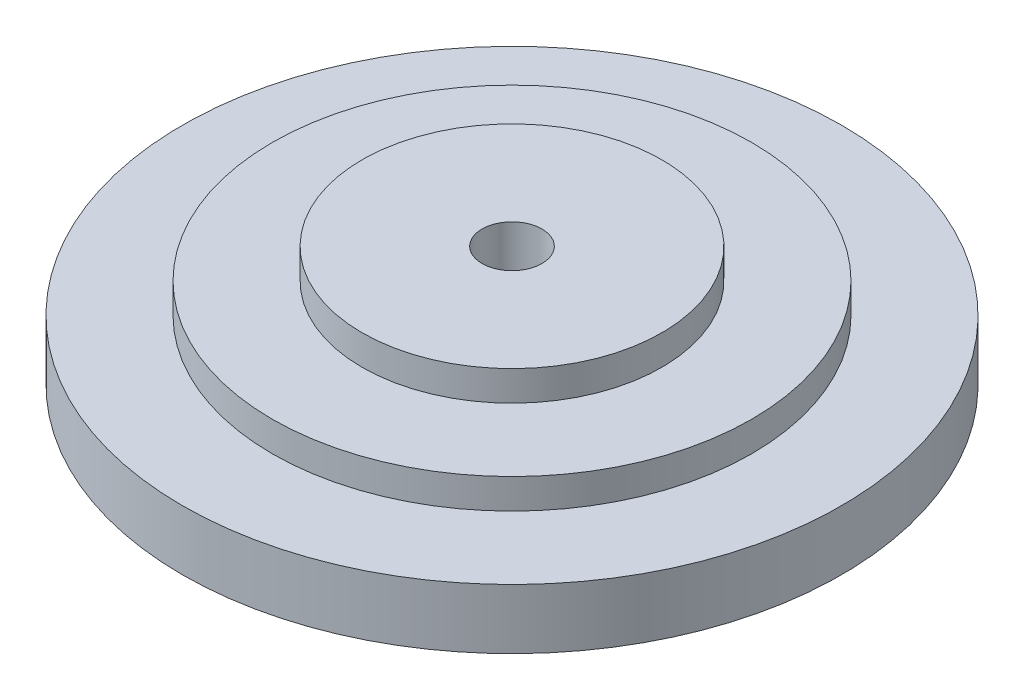
ISO-10303-21;
HEADER;
FILE_DESCRIPTION(('STEP AP214'),'2;1');
FILE_NAME('part.step','',(''),(''),'','','');
FILE_SCHEMA(('AUTOMOTIVE_DESIGN { 1 0 10303 214 1 1 1 1 }'));
ENDSEC;
DATA;
#1=APPLICATION_CONTEXT('core data for automotive mechanical design processes');
#2=APPLICATION_PROTOCOL_DEFINITION('international standard','automotive_design',2000,#1);
#3=PRODUCT_CONTEXT('',#1,'mechanical');
#4=PRODUCT('Part','Part','',(#3));
#5=PRODUCT_RELATED_PRODUCT_CATEGORY('part','',(#4));
#6=PRODUCT_DEFINITION_FORMATION('','',#4);
#7=PRODUCT_DEFINITION_CONTEXT('part definition',#1,'design');
#8=PRODUCT_DEFINITION('design','',#6,#7);
#9=PRODUCT_DEFINITION_SHAPE('','',#8);
#10=(LENGTH_UNIT() NAMED_UNIT(*) SI_UNIT(.MILLI.,.METRE.));
#11=(NAMED_UNIT(*) PLANE_ANGLE_UNIT() SI_UNIT($,.RADIAN.));
#12=(NAMED_UNIT(*) SI_UNIT($,.STERADIAN.) SOLID_ANGLE_UNIT());
#13=UNCERTAINTY_MEASURE_WITH_UNIT(LENGTH_MEASURE(1.E-05),#10,'distance_accuracy_value','');
#14=(GEOMETRIC_REPRESENTATION_CONTEXT(3) GLOBAL_UNCERTAINTY_ASSIGNED_CONTEXT((#13)) GLOBAL_UNIT_ASSIGNED_CONTEXT((#10,
#11,#12)) REPRESENTATION_CONTEXT('',''));
#15=CARTESIAN_POINT('',(0.,0.,0.));
#16=DIRECTION('',(0.,0.,1.));
#17=DIRECTION('',(1.,0.,0.));
#18=AXIS2_PLACEMENT_3D('',#15,#16,#17);
#19=CARTESIAN_POINT('',(0.,10.,0.));
#20=DIRECTION('',(0.,-1.,0.));
#21=DIRECTION('',(0.,0.,-1.));
#22=AXIS2_PLACEMENT_3D('',#19,#20,#21);
#23=CYLINDRICAL_SURFACE('',#22,55.0225);
#24=CARTESIAN_POINT('',(0.,10.,0.));
#25=DIRECTION('',(0.,1.,0.));
#26=DIRECTION('',(0.,0.,1.));
#27=AXIS2_PLACEMENT_3D('',#24,#25,#26);
#28=CIRCLE('',#27,55.0225);
#29=CARTESIAN_POINT('',(0.,10.,55.0225));
#30=VERTEX_POINT('',#29);
#31=EDGE_CURVE('E10',#30,#30,#28,.T.);
#32=ORIENTED_EDGE('',*,*,#31,.F.);
#33=EDGE_LOOP('',(#32));
#34=FACE_BOUND('',#33,.T.);
#35=CARTESIAN_POINT('',(0.,0.,0.));
#36=DIRECTION('',(0.,1.,0.));
#37=DIRECTION('',(0.,0.,1.));
#38=AXIS2_PLACEMENT_3D('',#35,#36,#37);
#39=CIRCLE('',#38,55.0225);
#40=CARTESIAN_POINT('',(0.,0.,55.0225));
#41=VERTEX_POINT('',#40);
#42=EDGE_CURVE('E38',#41,#41,#39,.T.);
#43=ORIENTED_EDGE('',*,*,#42,.T.);
#44=EDGE_LOOP('',(#43));
#45=FACE_BOUND('',#44,.T.);
#46=ADVANCED_FACE('F35',(#34,#45),#23,.T.);
#47=CARTESIAN_POINT('',(0.,10.,0.));
#48=DIRECTION('',(0.,1.,0.));
#49=DIRECTION('',(0.,0.,1.));
#50=AXIS2_PLACEMENT_3D('',#47,#48,#49);
#51=PLANE('',#50);
#52=CARTESIAN_POINT('',(0.,10.,0.));
#53=DIRECTION('',(0.,1.,0.));
#54=DIRECTION('',(0.,0.,1.));
#55=AXIS2_PLACEMENT_3D('',#52,#53,#54);
#56=CIRCLE('',#55,40.0225);
#57=CARTESIAN_POINT('',(0.,10.,40.0225));
#58=VERTEX_POINT('',#57);
#59=EDGE_CURVE('E42',#58,#58,#56,.T.);
#60=ORIENTED_EDGE('',*,*,#59,.F.);
#61=EDGE_LOOP('',(#60));
#62=FACE_BOUND('',#61,.T.);
#63=ORIENTED_EDGE('',*,*,#31,.T.);
#64=EDGE_LOOP('',(#63));
#65=FACE_BOUND('',#64,.T.);
#66=ADVANCED_FACE('F83',(#62,#65),#51,.T.);
#67=CARTESIAN_POINT('',(0.,0.,0.));
#68=DIRECTION('',(0.,1.,0.));
#69=DIRECTION('',(0.,0.,1.));
#70=AXIS2_PLACEMENT_3D('',#67,#68,#69);
#71=PLANE('',#70);
#72=ORIENTED_EDGE('',*,*,#42,.F.);
#73=EDGE_LOOP('',(#72));
#74=FACE_BOUND('',#73,.T.);
#75=CARTESIAN_POINT('',(0.,0.,0.));
#76=DIRECTION('',(0.,1.,0.));
#77=DIRECTION('',(0.,0.,1.));
#78=AXIS2_PLACEMENT_3D('',#75,#76,#77);
#79=CIRCLE('',#78,5.);
#80=CARTESIAN_POINT('',(0.,0.,5.));
#81=VERTEX_POINT('',#80);
#82=EDGE_CURVE('E55',#81,#81,#79,.T.);
#83=ORIENTED_EDGE('',*,*,#82,.T.);
#84=EDGE_LOOP('',(#83));
#85=FACE_BOUND('',#84,.T.);
#86=ADVANCED_FACE('F88',(#74,#85),#71,.F.);
#87=CARTESIAN_POINT('',(0.,15.,0.));
#88=DIRECTION('',(0.,-1.,0.));
#89=DIRECTION('',(0.,0.,-1.));
#90=AXIS2_PLACEMENT_3D('',#87,#88,#89);
#91=CYLINDRICAL_SURFACE('',#90,40.0225);
#92=ORIENTED_EDGE('',*,*,#59,.T.);
#93=EDGE_LOOP('',(#92));
#94=FACE_BOUND('',#93,.T.);
#95=CARTESIAN_POINT('',(0.,15.,0.));
#96=DIRECTION('',(0.,1.,0.));
#97=DIRECTION('',(0.,0.,1.));
#98=AXIS2_PLACEMENT_3D('',#95,#96,#97);
#99=CIRCLE('',#98,40.0225);
#100=CARTESIAN_POINT('',(0.,15.,40.0225));
#101=VERTEX_POINT('',#100);
#102=EDGE_CURVE('E48',#101,#101,#99,.T.);
#103=ORIENTED_EDGE('',*,*,#102,.F.);
#104=EDGE_LOOP('',(#103));
#105=FACE_BOUND('',#104,.T.);
#106=ADVANCED_FACE('F97',(#94,#105),#91,.T.);
#107=CARTESIAN_POINT('',(0.,15.,0.));
#108=DIRECTION('',(0.,1.,0.));
#109=DIRECTION('',(0.,0.,1.));
#110=AXIS2_PLACEMENT_3D('',#107,#108,#109);
#111=PLANE('',#110);
#112=CARTESIAN_POINT('',(0.,15.,0.));
#113=DIRECTION('',(0.,1.,0.));
#114=DIRECTION('',(0.,0.,1.));
#115=AXIS2_PLACEMENT_3D('',#112,#113,#114);
#116=CIRCLE('',#115,25.0225);
#117=CARTESIAN_POINT('',(0.,15.,25.0225));
#118=VERTEX_POINT('',#117);
#119=EDGE_CURVE('E51',#118,#118,#116,.T.);
#120=ORIENTED_EDGE('',*,*,#119,.F.);
#121=EDGE_LOOP('',(#120));
#122=FACE_BOUND('',#121,.T.);
#123=ORIENTED_EDGE('',*,*,#102,.T.);
#124=EDGE_LOOP('',(#123));
#125=FACE_BOUND('',#124,.T.);
#126=ADVANCED_FACE('F80',(#122,#125),#111,.T.);
#127=CARTESIAN_POINT('',(0.,20.,0.));
#128=DIRECTION('',(0.,-1.,0.));
#129=DIRECTION('',(0.,0.,-1.));
#130=AXIS2_PLACEMENT_3D('',#127,#128,#129);
#131=CYLINDRICAL_SURFACE('',#130,5.);
#132=CARTESIAN_POINT('',(0.,20.,0.));
#133=DIRECTION('',(0.,1.,0.));
#134=DIRECTION('',(0.,0.,1.));
#135=AXIS2_PLACEMENT_3D('',#132,#133,#134);
#136=CIRCLE('',#135,5.);
#137=CARTESIAN_POINT('',(0.,20.,5.));
#138=VERTEX_POINT('',#137);
#139=EDGE_CURVE('E58',#138,#138,#136,.T.);
#140=ORIENTED_EDGE('',*,*,#139,.T.);
#141=EDGE_LOOP('',(#140));
#142=FACE_BOUND('',#141,.T.);
#143=ORIENTED_EDGE('',*,*,#82,.F.);
#144=EDGE_LOOP('',(#143));
#145=FACE_BOUND('',#144,.T.);
#146=ADVANCED_FACE('F64',(#142,#145),#131,.F.);
#147=CARTESIAN_POINT('',(0.,20.,0.));
#148=DIRECTION('',(0.,-1.,0.));
#149=DIRECTION('',(0.,0.,-1.));
#150=AXIS2_PLACEMENT_3D('',#147,#148,#149);
#151=CYLINDRICAL_SURFACE('',#150,25.0225);
#152=ORIENTED_EDGE('',*,*,#119,.T.);
#153=EDGE_LOOP('',(#152));
#154=FACE_BOUND('',#153,.T.);
#155=CARTESIAN_POINT('',(0.,20.,0.));
#156=DIRECTION('',(0.,1.,0.));
#157=DIRECTION('',(0.,0.,1.));
#158=AXIS2_PLACEMENT_3D('',#155,#156,#157);
#159=CIRCLE('',#158,25.0225);
#160=CARTESIAN_POINT('',(0.,20.,25.0225));
#161=VERTEX_POINT('',#160);
#162=EDGE_CURVE('E54',#161,#161,#159,.T.);
#163=ORIENTED_EDGE('',*,*,#162,.F.);
#164=EDGE_LOOP('',(#163));
#165=FACE_BOUND('',#164,.T.);
#166=ADVANCED_FACE('F70',(#154,#165),#151,.T.);
#167=CARTESIAN_POINT('',(0.,20.,0.));
#168=DIRECTION('',(0.,1.,0.));
#169=DIRECTION('',(0.,0.,1.));
#170=AXIS2_PLACEMENT_3D('',#167,#168,#169);
#171=PLANE('',#170);
#172=ORIENTED_EDGE('',*,*,#139,.F.);
#173=EDGE_LOOP('',(#172));
#174=FACE_BOUND('',#173,.T.);
#175=ORIENTED_EDGE('',*,*,#162,.T.);
#176=EDGE_LOOP('',(#175));
#177=FACE_BOUND('',#176,.T.);
#178=ADVANCED_FACE('F67',(#174,#177),#171,.T.);
#179=CLOSED_SHELL('',(#46,#66,#86,#106,#126,#146,#166,#178));
#180=MANIFOLD_SOLID_BREP('B2',#179);
#181=ADVANCED_BREP_SHAPE_REPRESENTATION('',(#18,#180),#14);
#182=SHAPE_DEFINITION_REPRESENTATION(#9,#181);
ENDSEC;
END-ISO-10303-21;
